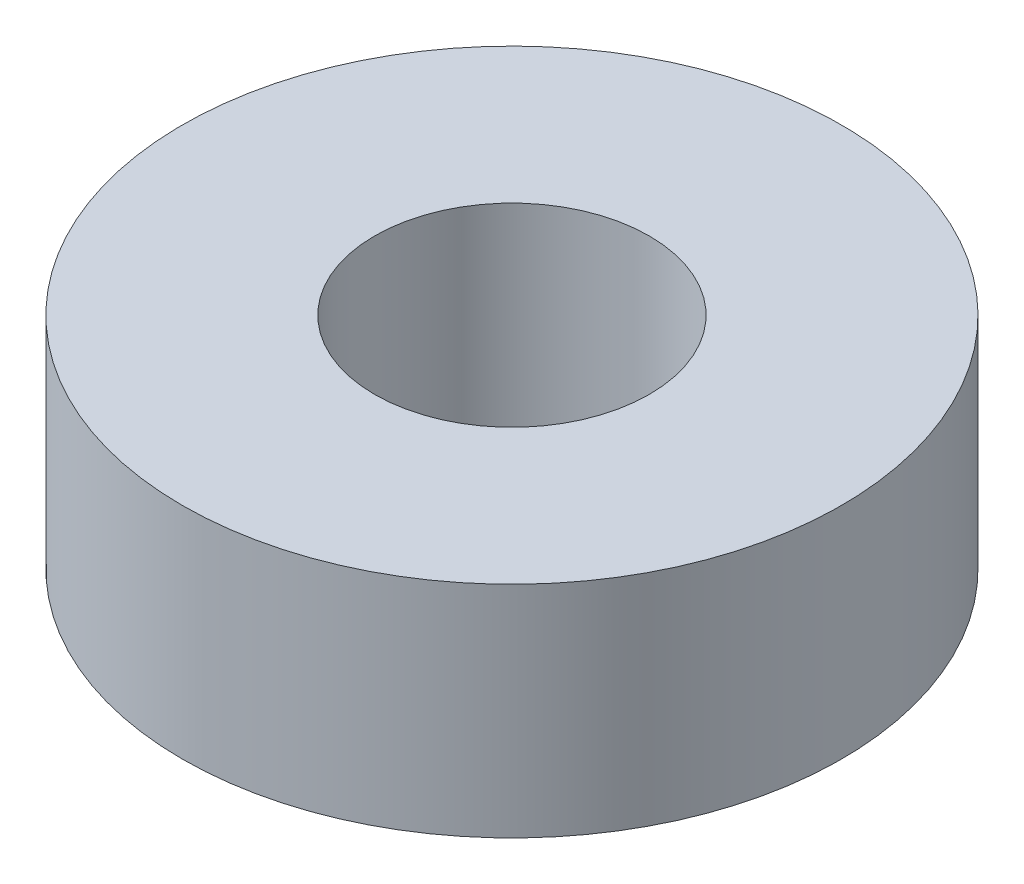
ISO-10303-21;
HEADER;
FILE_DESCRIPTION(('STEP AP214'),'2;1');
FILE_NAME('part.step','',(''),(''),'','','');
FILE_SCHEMA(('AUTOMOTIVE_DESIGN { 1 0 10303 214 1 1 1 1 }'));
ENDSEC;
DATA;
#1=APPLICATION_CONTEXT('core data for automotive mechanical design processes');
#2=APPLICATION_PROTOCOL_DEFINITION('international standard','automotive_design',2000,#1);
#3=PRODUCT_CONTEXT('',#1,'mechanical');
#4=PRODUCT('Part','Part','',(#3));
#5=PRODUCT_RELATED_PRODUCT_CATEGORY('part','',(#4));
#6=PRODUCT_DEFINITION_FORMATION('','',#4);
#7=PRODUCT_DEFINITION_CONTEXT('part definition',#1,'design');
#8=PRODUCT_DEFINITION('design','',#6,#7);
#9=PRODUCT_DEFINITION_SHAPE('','',#8);
#10=(LENGTH_UNIT() NAMED_UNIT(*) SI_UNIT(.MILLI.,.METRE.));
#11=(NAMED_UNIT(*) PLANE_ANGLE_UNIT() SI_UNIT($,.RADIAN.));
#12=(NAMED_UNIT(*) SI_UNIT($,.STERADIAN.) SOLID_ANGLE_UNIT());
#13=UNCERTAINTY_MEASURE_WITH_UNIT(LENGTH_MEASURE(1.E-05),#10,'distance_accuracy_value','');
#14=(GEOMETRIC_REPRESENTATION_CONTEXT(3) GLOBAL_UNCERTAINTY_ASSIGNED_CONTEXT((#13)) GLOBAL_UNIT_ASSIGNED_CONTEXT((#10,
#11,#12)) REPRESENTATION_CONTEXT('',''));
#15=CARTESIAN_POINT('',(0.,0.,0.));
#16=DIRECTION('',(0.,0.,1.));
#17=DIRECTION('',(1.,0.,0.));
#18=AXIS2_PLACEMENT_3D('',#15,#16,#17);
#19=CARTESIAN_POINT('',(0.,2.,0.));
#20=DIRECTION('',(0.,1.,0.));
#21=DIRECTION('',(0.,0.,1.));
#22=AXIS2_PLACEMENT_3D('',#19,#20,#21);
#23=PLANE('',#22);
#24=CARTESIAN_POINT('',(0.,2.,0.));
#25=DIRECTION('',(0.,1.,0.));
#26=DIRECTION('',(0.,0.,1.));
#27=AXIS2_PLACEMENT_3D('',#24,#25,#26);
#28=CIRCLE('',#27,3.);
#29=CARTESIAN_POINT('',(0.,2.,3.));
#30=VERTEX_POINT('',#29);
#31=EDGE_CURVE('E10',#30,#30,#28,.T.);
#32=ORIENTED_EDGE('',*,*,#31,.T.);
#33=EDGE_LOOP('',(#32));
#34=FACE_BOUND('',#33,.T.);
#35=CARTESIAN_POINT('',(0.,2.,0.));
#36=DIRECTION('',(0.,1.,0.));
#37=DIRECTION('',(0.,0.,1.));
#38=AXIS2_PLACEMENT_3D('',#35,#36,#37);
#39=CIRCLE('',#38,1.25);
#40=CARTESIAN_POINT('',(0.,2.,1.25));
#41=VERTEX_POINT('',#40);
#42=EDGE_CURVE('E48',#41,#41,#39,.T.);
#43=ORIENTED_EDGE('',*,*,#42,.F.);
#44=EDGE_LOOP('',(#43));
#45=FACE_BOUND('',#44,.T.);
#46=ADVANCED_FACE('F37',(#34,#45),#23,.T.);
#47=CARTESIAN_POINT('',(0.,0.,0.));
#48=DIRECTION('',(0.,1.,0.));
#49=DIRECTION('',(0.,0.,1.));
#50=AXIS2_PLACEMENT_3D('',#47,#48,#49);
#51=PLANE('',#50);
#52=CARTESIAN_POINT('',(0.,0.,0.));
#53=DIRECTION('',(0.,1.,0.));
#54=DIRECTION('',(0.,0.,1.));
#55=AXIS2_PLACEMENT_3D('',#52,#53,#54);
#56=CIRCLE('',#55,3.);
#57=CARTESIAN_POINT('',(0.,0.,3.));
#58=VERTEX_POINT('',#57);
#59=EDGE_CURVE('E41',#58,#58,#56,.T.);
#60=ORIENTED_EDGE('',*,*,#59,.F.);
#61=EDGE_LOOP('',(#60));
#62=FACE_BOUND('',#61,.T.);
#63=CARTESIAN_POINT('',(0.,0.,0.));
#64=DIRECTION('',(0.,1.,0.));
#65=DIRECTION('',(0.,0.,1.));
#66=AXIS2_PLACEMENT_3D('',#63,#64,#65);
#67=CIRCLE('',#66,1.25);
#68=CARTESIAN_POINT('',(0.,0.,1.25));
#69=VERTEX_POINT('',#68);
#70=EDGE_CURVE('E50',#69,#69,#67,.T.);
#71=ORIENTED_EDGE('',*,*,#70,.T.);
#72=EDGE_LOOP('',(#71));
#73=FACE_BOUND('',#72,.T.);
#74=ADVANCED_FACE('F60',(#62,#73),#51,.F.);
#75=CARTESIAN_POINT('',(0.,2.,0.));
#76=DIRECTION('',(0.,-1.,0.));
#77=DIRECTION('',(0.,0.,-1.));
#78=AXIS2_PLACEMENT_3D('',#75,#76,#77);
#79=CYLINDRICAL_SURFACE('',#78,3.);
#80=ORIENTED_EDGE('',*,*,#31,.F.);
#81=EDGE_LOOP('',(#80));
#82=FACE_BOUND('',#81,.T.);
#83=ORIENTED_EDGE('',*,*,#59,.T.);
#84=EDGE_LOOP('',(#83));
#85=FACE_BOUND('',#84,.T.);
#86=ADVANCED_FACE('F39',(#82,#85),#79,.T.);
#87=CARTESIAN_POINT('',(0.,2.,0.));
#88=DIRECTION('',(0.,-1.,0.));
#89=DIRECTION('',(0.,0.,-1.));
#90=AXIS2_PLACEMENT_3D('',#87,#88,#89);
#91=CYLINDRICAL_SURFACE('',#90,1.25);
#92=ORIENTED_EDGE('',*,*,#42,.T.);
#93=EDGE_LOOP('',(#92));
#94=FACE_BOUND('',#93,.T.);
#95=ORIENTED_EDGE('',*,*,#70,.F.);
#96=EDGE_LOOP('',(#95));
#97=FACE_BOUND('',#96,.T.);
#98=ADVANCED_FACE('F56',(#94,#97),#91,.F.);
#99=CLOSED_SHELL('',(#46,#74,#86,#98));
#100=MANIFOLD_SOLID_BREP('B2',#99);
#101=ADVANCED_BREP_SHAPE_REPRESENTATION('',(#18,#100),#14);
#102=SHAPE_DEFINITION_REPRESENTATION(#9,#101);
ENDSEC;
END-ISO-10303-21;
